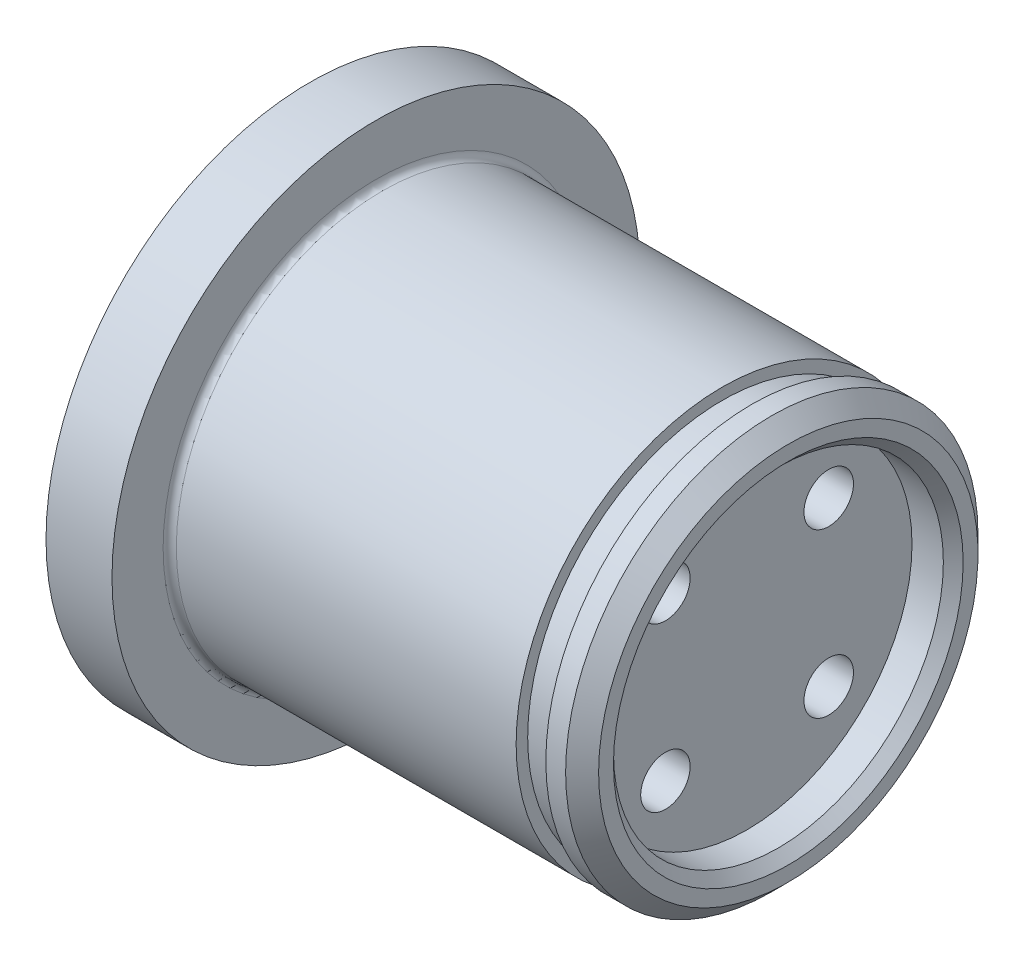
ISO-10303-21;
HEADER;
FILE_DESCRIPTION(('STEP AP214'),'2;1');
FILE_NAME('part.step','',(''),(''),'','','');
FILE_SCHEMA(('AUTOMOTIVE_DESIGN { 1 0 10303 214 1 1 1 1 }'));
ENDSEC;
DATA;
#1=APPLICATION_CONTEXT('core data for automotive mechanical design processes');
#2=APPLICATION_PROTOCOL_DEFINITION('international standard','automotive_design',2000,#1);
#3=PRODUCT_CONTEXT('',#1,'mechanical');
#4=PRODUCT('Part','Part','',(#3));
#5=PRODUCT_RELATED_PRODUCT_CATEGORY('part','',(#4));
#6=PRODUCT_DEFINITION_FORMATION('','',#4);
#7=PRODUCT_DEFINITION_CONTEXT('part definition',#1,'design');
#8=PRODUCT_DEFINITION('design','',#6,#7);
#9=PRODUCT_DEFINITION_SHAPE('','',#8);
#10=(LENGTH_UNIT() NAMED_UNIT(*) SI_UNIT(.MILLI.,.METRE.));
#11=(NAMED_UNIT(*) PLANE_ANGLE_UNIT() SI_UNIT($,.RADIAN.));
#12=(NAMED_UNIT(*) SI_UNIT($,.STERADIAN.) SOLID_ANGLE_UNIT());
#13=UNCERTAINTY_MEASURE_WITH_UNIT(LENGTH_MEASURE(1.E-05),#10,'distance_accuracy_value','');
#14=(GEOMETRIC_REPRESENTATION_CONTEXT(3) GLOBAL_UNCERTAINTY_ASSIGNED_CONTEXT((#13)) GLOBAL_UNIT_ASSIGNED_CONTEXT((#10,
#11,#12)) REPRESENTATION_CONTEXT('',''));
#15=CARTESIAN_POINT('',(0.,0.,0.));
#16=DIRECTION('',(0.,0.,1.));
#17=DIRECTION('',(1.,0.,0.));
#18=AXIS2_PLACEMENT_3D('',#15,#16,#17);
#19=CARTESIAN_POINT('',(0.,0.,0.));
#20=DIRECTION('',(-1.,0.,0.));
#21=DIRECTION('',(0.,0.,1.));
#22=AXIS2_PLACEMENT_3D('',#19,#20,#21);
#23=PLANE('',#22);
#24=CARTESIAN_POINT('',(0.,0.,0.));
#25=DIRECTION('',(-1.,0.,0.));
#26=DIRECTION('',(0.,0.,1.));
#27=AXIS2_PLACEMENT_3D('',#24,#25,#26);
#28=CIRCLE('',#27,10.6);
#29=CARTESIAN_POINT('',(0.,0.,10.6));
#30=VERTEX_POINT('',#29);
#31=EDGE_CURVE('E10',#30,#30,#28,.T.);
#32=ORIENTED_EDGE('',*,*,#31,.T.);
#33=EDGE_LOOP('',(#32));
#34=FACE_BOUND('',#33,.T.);
#35=CARTESIAN_POINT('',(0.,0.,0.));
#36=DIRECTION('',(-1.,0.,0.));
#37=DIRECTION('',(0.,0.,1.));
#38=AXIS2_PLACEMENT_3D('',#35,#36,#37);
#39=CIRCLE('',#38,11.5);
#40=CARTESIAN_POINT('',(0.,0.,11.5));
#41=VERTEX_POINT('',#40);
#42=EDGE_CURVE('E57',#41,#41,#39,.F.);
#43=ORIENTED_EDGE('',*,*,#42,.T.);
#44=EDGE_LOOP('',(#43));
#45=FACE_BOUND('',#44,.T.);
#46=ADVANCED_FACE('F32',(#34,#45),#23,.F.);
#47=CARTESIAN_POINT('',(0.,0.,0.));
#48=DIRECTION('',(-1.,0.,0.));
#49=DIRECTION('',(0.,0.,1.));
#50=AXIS2_PLACEMENT_3D('',#47,#48,#49);
#51=CYLINDRICAL_SURFACE('',#50,12.5);
#52=CARTESIAN_POINT('',(-24.6,0.,0.));
#53=DIRECTION('',(-1.,0.,0.));
#54=DIRECTION('',(0.,0.,1.));
#55=AXIS2_PLACEMENT_3D('',#52,#53,#54);
#56=CIRCLE('',#55,12.5);
#57=CARTESIAN_POINT('',(-24.6,0.,12.5));
#58=VERTEX_POINT('',#57);
#59=EDGE_CURVE('E43',#58,#58,#56,.F.);
#60=ORIENTED_EDGE('',*,*,#59,.T.);
#61=EDGE_LOOP('',(#60));
#62=FACE_BOUND('',#61,.T.);
#63=CARTESIAN_POINT('',(-4.00000000000001,0.,0.));
#64=DIRECTION('',(1.,0.,0.));
#65=DIRECTION('',(0.,0.,-1.));
#66=AXIS2_PLACEMENT_3D('',#63,#64,#65);
#67=CIRCLE('',#66,12.5);
#68=CARTESIAN_POINT('',(-4.00000000000001,0.,-12.5));
#69=VERTEX_POINT('',#68);
#70=EDGE_CURVE('E69',#69,#69,#67,.T.);
#71=ORIENTED_EDGE('',*,*,#70,.F.);
#72=EDGE_LOOP('',(#71));
#73=FACE_BOUND('',#72,.T.);
#74=ADVANCED_FACE('F120',(#62,#73),#51,.T.);
#75=CARTESIAN_POINT('',(-25.,12.5,0.));
#76=DIRECTION('',(-1.,0.,0.));
#77=DIRECTION('',(0.,0.,1.));
#78=AXIS2_PLACEMENT_3D('',#75,#76,#77);
#79=PLANE('',#78);
#80=CARTESIAN_POINT('',(-25.,0.,0.));
#81=DIRECTION('',(-1.,0.,0.));
#82=DIRECTION('',(0.,0.,1.));
#83=AXIS2_PLACEMENT_3D('',#80,#81,#82);
#84=CIRCLE('',#83,12.9);
#85=CARTESIAN_POINT('',(-25.,0.,12.9));
#86=VERTEX_POINT('',#85);
#87=EDGE_CURVE('E47',#86,#86,#84,.T.);
#88=ORIENTED_EDGE('',*,*,#87,.T.);
#89=EDGE_LOOP('',(#88));
#90=FACE_BOUND('',#89,.T.);
#91=CARTESIAN_POINT('',(-25.,0.,0.));
#92=DIRECTION('',(-1.,0.,0.));
#93=DIRECTION('',(0.,0.,1.));
#94=AXIS2_PLACEMENT_3D('',#91,#92,#93);
#95=CIRCLE('',#94,16.);
#96=CARTESIAN_POINT('',(-25.,0.,16.));
#97=VERTEX_POINT('',#96);
#98=EDGE_CURVE('E63',#97,#97,#95,.T.);
#99=ORIENTED_EDGE('',*,*,#98,.F.);
#100=EDGE_LOOP('',(#99));
#101=FACE_BOUND('',#100,.T.);
#102=ADVANCED_FACE('F125',(#90,#101),#79,.F.);
#103=CARTESIAN_POINT('',(0.,0.,0.));
#104=DIRECTION('',(-1.,0.,0.));
#105=DIRECTION('',(0.,0.,1.));
#106=AXIS2_PLACEMENT_3D('',#103,#104,#105);
#107=CYLINDRICAL_SURFACE('',#106,16.);
#108=CARTESIAN_POINT('',(-29.,0.,0.));
#109=DIRECTION('',(-1.,0.,0.));
#110=DIRECTION('',(0.,0.,1.));
#111=AXIS2_PLACEMENT_3D('',#108,#109,#110);
#112=CIRCLE('',#111,16.);
#113=CARTESIAN_POINT('',(-29.,0.,16.));
#114=VERTEX_POINT('',#113);
#115=EDGE_CURVE('E66',#114,#114,#112,.T.);
#116=ORIENTED_EDGE('',*,*,#115,.F.);
#117=EDGE_LOOP('',(#116));
#118=FACE_BOUND('',#117,.T.);
#119=ORIENTED_EDGE('',*,*,#98,.T.);
#120=EDGE_LOOP('',(#119));
#121=FACE_BOUND('',#120,.T.);
#122=ADVANCED_FACE('F151',(#118,#121),#107,.T.);
#123=CARTESIAN_POINT('',(-29.,16.,0.));
#124=DIRECTION('',(1.,0.,0.));
#125=DIRECTION('',(0.,0.,-1.));
#126=AXIS2_PLACEMENT_3D('',#123,#124,#125);
#127=PLANE('',#126);
#128=CARTESIAN_POINT('',(-29.,4.94974746830588,4.94974746830578));
#129=DIRECTION('',(1.,0.,0.));
#130=DIRECTION('',(0.,0.,-1.));
#131=AXIS2_PLACEMENT_3D('',#128,#129,#130);
#132=CIRCLE('',#131,1.50000000000001);
#133=CARTESIAN_POINT('',(-29.,4.94974746830588,3.44974746830577));
#134=VERTEX_POINT('',#133);
#135=EDGE_CURVE('E90',#134,#134,#132,.T.);
#136=ORIENTED_EDGE('',*,*,#135,.T.);
#137=EDGE_LOOP('',(#136));
#138=FACE_BOUND('',#137,.T.);
#139=CARTESIAN_POINT('',(-29.,-4.94974746830583,4.94974746830583));
#140=DIRECTION('',(1.,0.,0.));
#141=DIRECTION('',(0.,0.,-1.));
#142=AXIS2_PLACEMENT_3D('',#139,#140,#141);
#143=CIRCLE('',#142,1.50000000000001);
#144=CARTESIAN_POINT('',(-29.,-4.94974746830583,3.44974746830582));
#145=VERTEX_POINT('',#144);
#146=EDGE_CURVE('E87',#145,#145,#143,.T.);
#147=ORIENTED_EDGE('',*,*,#146,.T.);
#148=EDGE_LOOP('',(#147));
#149=FACE_BOUND('',#148,.T.);
#150=CARTESIAN_POINT('',(-29.,-4.94974746830585,-4.94974746830581));
#151=DIRECTION('',(1.,0.,0.));
#152=DIRECTION('',(0.,0.,-1.));
#153=AXIS2_PLACEMENT_3D('',#150,#151,#152);
#154=CIRCLE('',#153,1.50000000000001);
#155=CARTESIAN_POINT('',(-29.,-4.94974746830585,-6.44974746830583));
#156=VERTEX_POINT('',#155);
#157=EDGE_CURVE('E84',#156,#156,#154,.T.);
#158=ORIENTED_EDGE('',*,*,#157,.T.);
#159=EDGE_LOOP('',(#158));
#160=FACE_BOUND('',#159,.T.);
#161=CARTESIAN_POINT('',(-29.,4.94974746830583,-4.94974746830583));
#162=DIRECTION('',(1.,0.,0.));
#163=DIRECTION('',(0.,0.,-1.));
#164=AXIS2_PLACEMENT_3D('',#161,#162,#163);
#165=CIRCLE('',#164,1.50000000000001);
#166=CARTESIAN_POINT('',(-29.,4.94974746830583,-6.44974746830584));
#167=VERTEX_POINT('',#166);
#168=EDGE_CURVE('E81',#167,#167,#165,.T.);
#169=ORIENTED_EDGE('',*,*,#168,.T.);
#170=EDGE_LOOP('',(#169));
#171=FACE_BOUND('',#170,.T.);
#172=ORIENTED_EDGE('',*,*,#115,.T.);
#173=EDGE_LOOP('',(#172));
#174=FACE_BOUND('',#173,.T.);
#175=ADVANCED_FACE('F155',(#138,#149,#160,#171,#174),#127,.F.);
#176=CARTESIAN_POINT('',(-4.,12.5,0.));
#177=DIRECTION('',(-1.,0.,0.));
#178=DIRECTION('',(0.,0.,1.));
#179=AXIS2_PLACEMENT_3D('',#176,#177,#178);
#180=PLANE('',#179);
#181=CARTESIAN_POINT('',(-4.,0.,0.));
#182=DIRECTION('',(1.,0.,0.));
#183=DIRECTION('',(0.,0.,-1.));
#184=AXIS2_PLACEMENT_3D('',#181,#182,#183);
#185=CIRCLE('',#184,11.8);
#186=CARTESIAN_POINT('',(-4.,0.,-11.8));
#187=VERTEX_POINT('',#186);
#188=EDGE_CURVE('E72',#187,#187,#185,.T.);
#189=ORIENTED_EDGE('',*,*,#188,.F.);
#190=EDGE_LOOP('',(#189));
#191=FACE_BOUND('',#190,.T.);
#192=ORIENTED_EDGE('',*,*,#70,.T.);
#193=EDGE_LOOP('',(#192));
#194=FACE_BOUND('',#193,.T.);
#195=ADVANCED_FACE('F161',(#191,#194),#180,.F.);
#196=CARTESIAN_POINT('',(0.,0.,0.));
#197=DIRECTION('',(1.,0.,0.));
#198=DIRECTION('',(0.,0.,-1.));
#199=AXIS2_PLACEMENT_3D('',#196,#197,#198);
#200=CYLINDRICAL_SURFACE('',#199,11.8);
#201=CARTESIAN_POINT('',(-2.2,0.,0.));
#202=DIRECTION('',(1.,0.,0.));
#203=DIRECTION('',(0.,0.,-1.));
#204=AXIS2_PLACEMENT_3D('',#201,#202,#203);
#205=CIRCLE('',#204,11.8);
#206=CARTESIAN_POINT('',(-2.2,0.,-11.8));
#207=VERTEX_POINT('',#206);
#208=EDGE_CURVE('E75',#207,#207,#205,.T.);
#209=ORIENTED_EDGE('',*,*,#208,.F.);
#210=EDGE_LOOP('',(#209));
#211=FACE_BOUND('',#210,.T.);
#212=ORIENTED_EDGE('',*,*,#188,.T.);
#213=EDGE_LOOP('',(#212));
#214=FACE_BOUND('',#213,.T.);
#215=ADVANCED_FACE('F168',(#211,#214),#200,.T.);
#216=CARTESIAN_POINT('',(-2.2,11.8,0.));
#217=DIRECTION('',(1.,0.,0.));
#218=DIRECTION('',(0.,0.,-1.));
#219=AXIS2_PLACEMENT_3D('',#216,#217,#218);
#220=PLANE('',#219);
#221=CARTESIAN_POINT('',(-2.20000000000001,0.,0.));
#222=DIRECTION('',(1.,0.,0.));
#223=DIRECTION('',(0.,0.,-1.));
#224=AXIS2_PLACEMENT_3D('',#221,#222,#223);
#225=CIRCLE('',#224,12.5);
#226=CARTESIAN_POINT('',(-2.20000000000001,0.,-12.5));
#227=VERTEX_POINT('',#226);
#228=EDGE_CURVE('E78',#227,#227,#225,.T.);
#229=ORIENTED_EDGE('',*,*,#228,.F.);
#230=EDGE_LOOP('',(#229));
#231=FACE_BOUND('',#230,.T.);
#232=ORIENTED_EDGE('',*,*,#208,.T.);
#233=EDGE_LOOP('',(#232));
#234=FACE_BOUND('',#233,.T.);
#235=ADVANCED_FACE('F172',(#231,#234),#220,.F.);
#236=CARTESIAN_POINT('',(-1.00000000000001,0.,0.));
#237=DIRECTION('',(-1.,0.,0.));
#238=DIRECTION('',(0.,0.,1.));
#239=AXIS2_PLACEMENT_3D('',#236,#237,#238);
#240=CIRCLE('',#239,12.5);
#241=CARTESIAN_POINT('',(-1.00000000000001,0.,12.5));
#242=VERTEX_POINT('',#241);
#243=EDGE_CURVE('E60',#242,#242,#240,.T.);
#244=ORIENTED_EDGE('',*,*,#243,.T.);
#245=EDGE_LOOP('',(#244));
#246=FACE_BOUND('',#245,.T.);
#247=ORIENTED_EDGE('',*,*,#228,.T.);
#248=EDGE_LOOP('',(#247));
#249=FACE_BOUND('',#248,.T.);
#250=ADVANCED_FACE('F128',(#246,#249),#51,.T.);
#251=CARTESIAN_POINT('',(-1.00000000000001,0.,0.));
#252=DIRECTION('',(-1.,0.,0.));
#253=DIRECTION('',(0.,0.,1.));
#254=AXIS2_PLACEMENT_3D('',#251,#252,#253);
#255=CONICAL_SURFACE('',#254,12.5,0.785398163397449);
#256=ORIENTED_EDGE('',*,*,#42,.F.);
#257=EDGE_LOOP('',(#256));
#258=FACE_BOUND('',#257,.T.);
#259=ORIENTED_EDGE('',*,*,#243,.F.);
#260=EDGE_LOOP('',(#259));
#261=FACE_BOUND('',#260,.T.);
#262=ADVANCED_FACE('F132',(#258,#261),#255,.T.);
#263=CARTESIAN_POINT('',(-24.6,0.,0.));
#264=DIRECTION('',(-1.,0.,0.));
#265=DIRECTION('',(0.,0.,1.));
#266=AXIS2_PLACEMENT_3D('',#263,#264,#265);
#267=TOROIDAL_SURFACE('',#266,12.9,0.4);
#268=ORIENTED_EDGE('',*,*,#59,.F.);
#269=EDGE_LOOP('',(#268));
#270=FACE_BOUND('',#269,.T.);
#271=ORIENTED_EDGE('',*,*,#87,.F.);
#272=EDGE_LOOP('',(#271));
#273=FACE_BOUND('',#272,.T.);
#274=ADVANCED_FACE('F134',(#270,#273),#267,.F.);
#275=CARTESIAN_POINT('',(0.,4.94974746830583,-4.94974746830583));
#276=DIRECTION('',(1.,0.,0.));
#277=DIRECTION('',(0.,0.,-1.));
#278=AXIS2_PLACEMENT_3D('',#275,#276,#277);
#279=CYLINDRICAL_SURFACE('',#278,1.50000000000001);
#280=CARTESIAN_POINT('',(-2.5,4.94974746830583,-4.94974746830583));
#281=DIRECTION('',(-1.,0.,0.));
#282=DIRECTION('',(0.,0.,1.));
#283=AXIS2_PLACEMENT_3D('',#280,#281,#282);
#284=CIRCLE('',#283,1.50000000000001);
#285=CARTESIAN_POINT('',(-2.5,4.94974746830583,-3.44974746830582));
#286=VERTEX_POINT('',#285);
#287=EDGE_CURVE('E93',#286,#286,#284,.F.);
#288=ORIENTED_EDGE('',*,*,#287,.T.);
#289=EDGE_LOOP('',(#288));
#290=FACE_BOUND('',#289,.T.);
#291=ORIENTED_EDGE('',*,*,#168,.F.);
#292=EDGE_LOOP('',(#291));
#293=FACE_BOUND('',#292,.T.);
#294=ADVANCED_FACE('F137',(#290,#293),#279,.F.);
#295=CARTESIAN_POINT('',(0.,-4.94974746830585,-4.94974746830581));
#296=DIRECTION('',(1.,0.,0.));
#297=DIRECTION('',(0.,0.,-1.));
#298=AXIS2_PLACEMENT_3D('',#295,#296,#297);
#299=CYLINDRICAL_SURFACE('',#298,1.50000000000001);
#300=CARTESIAN_POINT('',(-2.5,-4.94974746830585,-4.94974746830581));
#301=DIRECTION('',(-1.,0.,0.));
#302=DIRECTION('',(0.,0.,1.));
#303=AXIS2_PLACEMENT_3D('',#300,#301,#302);
#304=CIRCLE('',#303,1.50000000000001);
#305=CARTESIAN_POINT('',(-2.5,-4.94974746830585,-3.4497474683058));
#306=VERTEX_POINT('',#305);
#307=EDGE_CURVE('E96',#306,#306,#304,.F.);
#308=ORIENTED_EDGE('',*,*,#307,.T.);
#309=EDGE_LOOP('',(#308));
#310=FACE_BOUND('',#309,.T.);
#311=ORIENTED_EDGE('',*,*,#157,.F.);
#312=EDGE_LOOP('',(#311));
#313=FACE_BOUND('',#312,.T.);
#314=ADVANCED_FACE('F142',(#310,#313),#299,.F.);
#315=CARTESIAN_POINT('',(0.,-4.94974746830583,4.94974746830583));
#316=DIRECTION('',(1.,0.,0.));
#317=DIRECTION('',(0.,0.,-1.));
#318=AXIS2_PLACEMENT_3D('',#315,#316,#317);
#319=CYLINDRICAL_SURFACE('',#318,1.50000000000001);
#320=CARTESIAN_POINT('',(-2.5,-4.94974746830583,4.94974746830583));
#321=DIRECTION('',(-1.,0.,0.));
#322=DIRECTION('',(0.,0.,1.));
#323=AXIS2_PLACEMENT_3D('',#320,#321,#322);
#324=CIRCLE('',#323,1.50000000000001);
#325=CARTESIAN_POINT('',(-2.5,-4.94974746830583,6.44974746830584));
#326=VERTEX_POINT('',#325);
#327=EDGE_CURVE('E52',#326,#326,#324,.F.);
#328=ORIENTED_EDGE('',*,*,#327,.T.);
#329=EDGE_LOOP('',(#328));
#330=FACE_BOUND('',#329,.T.);
#331=ORIENTED_EDGE('',*,*,#146,.F.);
#332=EDGE_LOOP('',(#331));
#333=FACE_BOUND('',#332,.T.);
#334=ADVANCED_FACE('F179',(#330,#333),#319,.F.);
#335=CARTESIAN_POINT('',(0.,4.94974746830588,4.94974746830578));
#336=DIRECTION('',(1.,0.,0.));
#337=DIRECTION('',(0.,0.,-1.));
#338=AXIS2_PLACEMENT_3D('',#335,#336,#337);
#339=CYLINDRICAL_SURFACE('',#338,1.50000000000001);
#340=CARTESIAN_POINT('',(-2.5,4.94974746830588,4.94974746830578));
#341=DIRECTION('',(-1.,0.,0.));
#342=DIRECTION('',(0.,0.,1.));
#343=AXIS2_PLACEMENT_3D('',#340,#341,#342);
#344=CIRCLE('',#343,1.50000000000001);
#345=CARTESIAN_POINT('',(-2.5,4.94974746830588,6.44974746830579));
#346=VERTEX_POINT('',#345);
#347=EDGE_CURVE('E50',#346,#346,#344,.F.);
#348=ORIENTED_EDGE('',*,*,#347,.T.);
#349=EDGE_LOOP('',(#348));
#350=FACE_BOUND('',#349,.T.);
#351=ORIENTED_EDGE('',*,*,#135,.F.);
#352=EDGE_LOOP('',(#351));
#353=FACE_BOUND('',#352,.T.);
#354=ADVANCED_FACE('F115',(#350,#353),#339,.F.);
#355=CARTESIAN_POINT('',(-2.5,10.,0.));
#356=DIRECTION('',(-1.,0.,0.));
#357=DIRECTION('',(0.,0.,1.));
#358=AXIS2_PLACEMENT_3D('',#355,#356,#357);
#359=PLANE('',#358);
#360=ORIENTED_EDGE('',*,*,#307,.F.);
#361=EDGE_LOOP('',(#360));
#362=FACE_BOUND('',#361,.T.);
#363=ORIENTED_EDGE('',*,*,#347,.F.);
#364=EDGE_LOOP('',(#363));
#365=FACE_BOUND('',#364,.T.);
#366=CARTESIAN_POINT('',(-2.5,0.,0.));
#367=DIRECTION('',(1.,0.,0.));
#368=DIRECTION('',(0.,0.,-1.));
#369=AXIS2_PLACEMENT_3D('',#366,#367,#368);
#370=CIRCLE('',#369,10.);
#371=CARTESIAN_POINT('',(-2.5,0.,-10.));
#372=VERTEX_POINT('',#371);
#373=EDGE_CURVE('E53',#372,#372,#370,.T.);
#374=ORIENTED_EDGE('',*,*,#373,.T.);
#375=EDGE_LOOP('',(#374));
#376=FACE_BOUND('',#375,.T.);
#377=ORIENTED_EDGE('',*,*,#327,.F.);
#378=EDGE_LOOP('',(#377));
#379=FACE_BOUND('',#378,.T.);
#380=ORIENTED_EDGE('',*,*,#287,.F.);
#381=EDGE_LOOP('',(#380));
#382=FACE_BOUND('',#381,.T.);
#383=ADVANCED_FACE('F104',(#362,#365,#376,#379,#382),#359,.F.);
#384=CARTESIAN_POINT('',(0.,0.,0.));
#385=DIRECTION('',(1.,0.,0.));
#386=DIRECTION('',(0.,0.,-1.));
#387=AXIS2_PLACEMENT_3D('',#384,#385,#386);
#388=CYLINDRICAL_SURFACE('',#387,10.);
#389=CARTESIAN_POINT('',(-0.599999999999998,0.,0.));
#390=DIRECTION('',(-1.,0.,0.));
#391=DIRECTION('',(0.,0.,1.));
#392=AXIS2_PLACEMENT_3D('',#389,#390,#391);
#393=CIRCLE('',#392,10.);
#394=CARTESIAN_POINT('',(-0.599999999999998,0.,10.));
#395=VERTEX_POINT('',#394);
#396=EDGE_CURVE('E39',#395,#395,#393,.F.);
#397=ORIENTED_EDGE('',*,*,#396,.T.);
#398=EDGE_LOOP('',(#397));
#399=FACE_BOUND('',#398,.T.);
#400=ORIENTED_EDGE('',*,*,#373,.F.);
#401=EDGE_LOOP('',(#400));
#402=FACE_BOUND('',#401,.T.);
#403=ADVANCED_FACE('F107',(#399,#402),#388,.F.);
#404=CARTESIAN_POINT('',(-0.599999999999998,0.,0.));
#405=DIRECTION('',(1.,0.,0.));
#406=DIRECTION('',(0.,0.,-1.));
#407=AXIS2_PLACEMENT_3D('',#404,#405,#406);
#408=CONICAL_SURFACE('',#407,10.,0.785398163397448);
#409=ORIENTED_EDGE('',*,*,#31,.F.);
#410=EDGE_LOOP('',(#409));
#411=FACE_BOUND('',#410,.T.);
#412=ORIENTED_EDGE('',*,*,#396,.F.);
#413=EDGE_LOOP('',(#412));
#414=FACE_BOUND('',#413,.T.);
#415=ADVANCED_FACE('F34',(#411,#414),#408,.F.);
#416=CLOSED_SHELL('',(#46,#74,#102,#122,#175,#195,#215,#235,#250,#262,#274,#294,#314,#334,#354,
#383,#403,#415));
#417=MANIFOLD_SOLID_BREP('B2',#416);
#418=ADVANCED_BREP_SHAPE_REPRESENTATION('',(#18,#417),#14);
#419=SHAPE_DEFINITION_REPRESENTATION(#9,#418);
ENDSEC;
END-ISO-10303-21;
